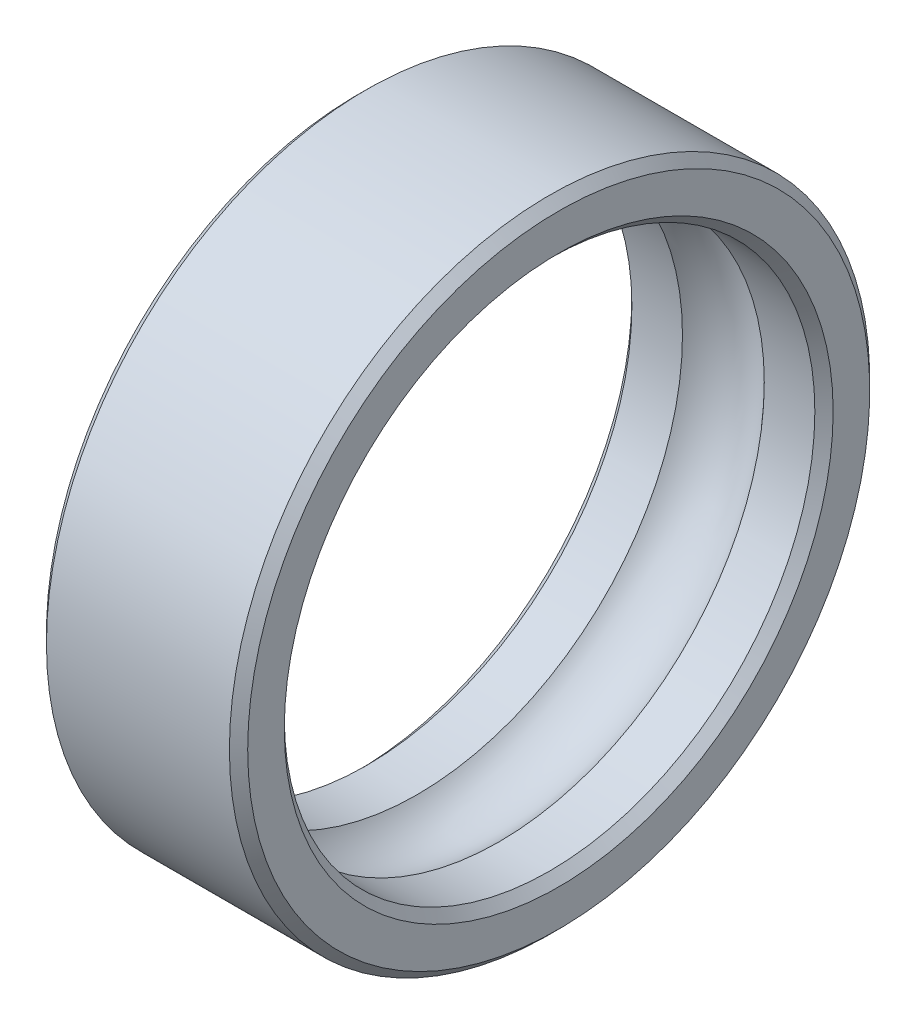
ISO-10303-21;
HEADER;
FILE_DESCRIPTION(('STEP AP214'),'2;1');
FILE_NAME('part.step','',(''),(''),'','','');
FILE_SCHEMA(('AUTOMOTIVE_DESIGN { 1 0 10303 214 1 1 1 1 }'));
ENDSEC;
DATA;
#1=APPLICATION_CONTEXT('core data for automotive mechanical design processes');
#2=APPLICATION_PROTOCOL_DEFINITION('international standard','automotive_design',2000,#1);
#3=PRODUCT_CONTEXT('',#1,'mechanical');
#4=PRODUCT('Part','Part','',(#3));
#5=PRODUCT_RELATED_PRODUCT_CATEGORY('part','',(#4));
#6=PRODUCT_DEFINITION_FORMATION('','',#4);
#7=PRODUCT_DEFINITION_CONTEXT('part definition',#1,'design');
#8=PRODUCT_DEFINITION('design','',#6,#7);
#9=PRODUCT_DEFINITION_SHAPE('','',#8);
#10=(LENGTH_UNIT() NAMED_UNIT(*) SI_UNIT(.MILLI.,.METRE.));
#11=(NAMED_UNIT(*) PLANE_ANGLE_UNIT() SI_UNIT($,.RADIAN.));
#12=(NAMED_UNIT(*) SI_UNIT($,.STERADIAN.) SOLID_ANGLE_UNIT());
#13=UNCERTAINTY_MEASURE_WITH_UNIT(LENGTH_MEASURE(1.E-05),#10,'distance_accuracy_value','');
#14=(GEOMETRIC_REPRESENTATION_CONTEXT(3) GLOBAL_UNCERTAINTY_ASSIGNED_CONTEXT((#13)) GLOBAL_UNIT_ASSIGNED_CONTEXT((#10,
#11,#12)) REPRESENTATION_CONTEXT('',''));
#15=CARTESIAN_POINT('',(0.,0.,0.));
#16=DIRECTION('',(0.,0.,1.));
#17=DIRECTION('',(1.,0.,0.));
#18=AXIS2_PLACEMENT_3D('',#15,#16,#17);
#19=CARTESIAN_POINT('',(-5.5,14.5,0.));
#20=DIRECTION('',(1.,0.,0.));
#21=DIRECTION('',(0.,0.,-1.));
#22=AXIS2_PLACEMENT_3D('',#19,#20,#21);
#23=PLANE('',#22);
#24=CARTESIAN_POINT('',(-5.5,0.,0.));
#25=DIRECTION('',(1.,0.,0.));
#26=DIRECTION('',(0.,0.,-1.));
#27=AXIS2_PLACEMENT_3D('',#24,#25,#26);
#28=CIRCLE('',#27,15.);
#29=CARTESIAN_POINT('',(-5.5,0.,-15.));
#30=VERTEX_POINT('',#29);
#31=EDGE_CURVE('E10',#30,#30,#28,.T.);
#32=ORIENTED_EDGE('',*,*,#31,.T.);
#33=EDGE_LOOP('',(#32));
#34=FACE_BOUND('',#33,.T.);
#35=CARTESIAN_POINT('',(-5.5,0.,0.));
#36=DIRECTION('',(1.,0.,0.));
#37=DIRECTION('',(0.,0.,-1.));
#38=AXIS2_PLACEMENT_3D('',#35,#36,#37);
#39=CIRCLE('',#38,17.);
#40=CARTESIAN_POINT('',(-5.5,0.,-17.));
#41=VERTEX_POINT('',#40);
#42=EDGE_CURVE('E50',#41,#41,#39,.F.);
#43=ORIENTED_EDGE('',*,*,#42,.T.);
#44=EDGE_LOOP('',(#43));
#45=FACE_BOUND('',#44,.T.);
#46=ADVANCED_FACE('F30',(#34,#45),#23,.F.);
#47=CARTESIAN_POINT('',(-7.5,0.,0.));
#48=DIRECTION('',(-1.,0.,0.));
#49=DIRECTION('',(0.,0.,1.));
#50=AXIS2_PLACEMENT_3D('',#47,#48,#49);
#51=CYLINDRICAL_SURFACE('',#50,17.5);
#52=CARTESIAN_POINT('',(5.,0.,0.));
#53=DIRECTION('',(-1.,0.,0.));
#54=DIRECTION('',(0.,0.,1.));
#55=AXIS2_PLACEMENT_3D('',#52,#53,#54);
#56=CIRCLE('',#55,17.5);
#57=CARTESIAN_POINT('',(5.,0.,17.5));
#58=VERTEX_POINT('',#57);
#59=EDGE_CURVE('E56',#58,#58,#56,.T.);
#60=ORIENTED_EDGE('',*,*,#59,.T.);
#61=EDGE_LOOP('',(#60));
#62=FACE_BOUND('',#61,.T.);
#63=CARTESIAN_POINT('',(-5.,0.,0.));
#64=DIRECTION('',(1.,0.,0.));
#65=DIRECTION('',(0.,0.,-1.));
#66=AXIS2_PLACEMENT_3D('',#63,#64,#65);
#67=CIRCLE('',#66,17.5);
#68=CARTESIAN_POINT('',(-5.,0.,-17.5));
#69=VERTEX_POINT('',#68);
#70=EDGE_CURVE('E59',#69,#69,#67,.T.);
#71=ORIENTED_EDGE('',*,*,#70,.T.);
#72=EDGE_LOOP('',(#71));
#73=FACE_BOUND('',#72,.T.);
#74=ADVANCED_FACE('F86',(#62,#73),#51,.T.);
#75=CARTESIAN_POINT('',(5.5,14.5,0.));
#76=DIRECTION('',(-1.,0.,0.));
#77=DIRECTION('',(0.,0.,1.));
#78=AXIS2_PLACEMENT_3D('',#75,#76,#77);
#79=PLANE('',#78);
#80=CARTESIAN_POINT('',(5.5,0.,0.));
#81=DIRECTION('',(-1.,0.,0.));
#82=DIRECTION('',(0.,0.,1.));
#83=AXIS2_PLACEMENT_3D('',#80,#81,#82);
#84=CIRCLE('',#83,15.);
#85=CARTESIAN_POINT('',(5.5,0.,15.));
#86=VERTEX_POINT('',#85);
#87=EDGE_CURVE('E45',#86,#86,#84,.T.);
#88=ORIENTED_EDGE('',*,*,#87,.T.);
#89=EDGE_LOOP('',(#88));
#90=FACE_BOUND('',#89,.T.);
#91=CARTESIAN_POINT('',(5.5,0.,0.));
#92=DIRECTION('',(-1.,0.,0.));
#93=DIRECTION('',(0.,0.,1.));
#94=AXIS2_PLACEMENT_3D('',#91,#92,#93);
#95=CIRCLE('',#94,17.);
#96=CARTESIAN_POINT('',(5.5,0.,17.));
#97=VERTEX_POINT('',#96);
#98=EDGE_CURVE('E53',#97,#97,#95,.F.);
#99=ORIENTED_EDGE('',*,*,#98,.T.);
#100=EDGE_LOOP('',(#99));
#101=FACE_BOUND('',#100,.T.);
#102=ADVANCED_FACE('F91',(#90,#101),#79,.F.);
#103=CARTESIAN_POINT('',(-7.5,0.,0.));
#104=DIRECTION('',(-1.,0.,0.));
#105=DIRECTION('',(0.,0.,1.));
#106=AXIS2_PLACEMENT_3D('',#103,#104,#105);
#107=CYLINDRICAL_SURFACE('',#106,14.5);
#108=CARTESIAN_POINT('',(5.,0.,0.));
#109=DIRECTION('',(-1.,0.,0.));
#110=DIRECTION('',(0.,0.,1.));
#111=AXIS2_PLACEMENT_3D('',#108,#109,#110);
#112=CIRCLE('',#111,14.5);
#113=CARTESIAN_POINT('',(5.,0.,14.5));
#114=VERTEX_POINT('',#113);
#115=EDGE_CURVE('E41',#114,#114,#112,.F.);
#116=ORIENTED_EDGE('',*,*,#115,.T.);
#117=EDGE_LOOP('',(#116));
#118=FACE_BOUND('',#117,.T.);
#119=CARTESIAN_POINT('',(2.23606797749979,0.,0.));
#120=DIRECTION('',(-1.,0.,0.));
#121=DIRECTION('',(0.,0.,1.));
#122=AXIS2_PLACEMENT_3D('',#119,#120,#121);
#123=CIRCLE('',#122,14.5);
#124=CARTESIAN_POINT('',(2.23606797749979,0.,14.5));
#125=VERTEX_POINT('',#124);
#126=EDGE_CURVE('E62',#125,#125,#123,.T.);
#127=ORIENTED_EDGE('',*,*,#126,.T.);
#128=EDGE_LOOP('',(#127));
#129=FACE_BOUND('',#128,.T.);
#130=ADVANCED_FACE('F82',(#118,#129),#107,.F.);
#131=CARTESIAN_POINT('',(0.,0.,0.));
#132=DIRECTION('',(-1.,0.,0.));
#133=DIRECTION('',(0.,0.,1.));
#134=AXIS2_PLACEMENT_3D('',#131,#132,#133);
#135=TOROIDAL_SURFACE('',#134,12.5,3.);
#136=ORIENTED_EDGE('',*,*,#126,.F.);
#137=EDGE_LOOP('',(#136));
#138=FACE_BOUND('',#137,.T.);
#139=CARTESIAN_POINT('',(-2.23606797749979,0.,0.));
#140=DIRECTION('',(-1.,0.,0.));
#141=DIRECTION('',(0.,0.,1.));
#142=AXIS2_PLACEMENT_3D('',#139,#140,#141);
#143=CIRCLE('',#142,14.5);
#144=CARTESIAN_POINT('',(-2.23606797749979,0.,14.5));
#145=VERTEX_POINT('',#144);
#146=EDGE_CURVE('E65',#145,#145,#143,.T.);
#147=ORIENTED_EDGE('',*,*,#146,.T.);
#148=EDGE_LOOP('',(#147));
#149=FACE_BOUND('',#148,.T.);
#150=ADVANCED_FACE('F69',(#138,#149),#135,.F.);
#151=CARTESIAN_POINT('',(-7.5,0.,0.));
#152=DIRECTION('',(-1.,0.,0.));
#153=DIRECTION('',(0.,0.,1.));
#154=AXIS2_PLACEMENT_3D('',#151,#152,#153);
#155=CYLINDRICAL_SURFACE('',#154,14.5);
#156=CARTESIAN_POINT('',(-4.99999999999999,0.,0.));
#157=DIRECTION('',(1.,0.,0.));
#158=DIRECTION('',(0.,0.,-1.));
#159=AXIS2_PLACEMENT_3D('',#156,#157,#158);
#160=CIRCLE('',#159,14.5);
#161=CARTESIAN_POINT('',(-4.99999999999999,0.,-14.5));
#162=VERTEX_POINT('',#161);
#163=EDGE_CURVE('E37',#162,#162,#160,.F.);
#164=ORIENTED_EDGE('',*,*,#163,.T.);
#165=EDGE_LOOP('',(#164));
#166=FACE_BOUND('',#165,.T.);
#167=ORIENTED_EDGE('',*,*,#146,.F.);
#168=EDGE_LOOP('',(#167));
#169=FACE_BOUND('',#168,.T.);
#170=ADVANCED_FACE('F71',(#166,#169),#155,.F.);
#171=CARTESIAN_POINT('',(5.,0.,0.));
#172=DIRECTION('',(-1.,0.,0.));
#173=DIRECTION('',(0.,0.,1.));
#174=AXIS2_PLACEMENT_3D('',#171,#172,#173);
#175=CONICAL_SURFACE('',#174,17.5,0.785398163397448);
#176=ORIENTED_EDGE('',*,*,#98,.F.);
#177=EDGE_LOOP('',(#176));
#178=FACE_BOUND('',#177,.T.);
#179=ORIENTED_EDGE('',*,*,#59,.F.);
#180=EDGE_LOOP('',(#179));
#181=FACE_BOUND('',#180,.T.);
#182=ADVANCED_FACE('F73',(#178,#181),#175,.T.);
#183=CARTESIAN_POINT('',(-5.5,0.,0.));
#184=DIRECTION('',(1.,0.,0.));
#185=DIRECTION('',(0.,0.,-1.));
#186=AXIS2_PLACEMENT_3D('',#183,#184,#185);
#187=CONICAL_SURFACE('',#186,17.,0.785398163397448);
#188=ORIENTED_EDGE('',*,*,#70,.F.);
#189=EDGE_LOOP('',(#188));
#190=FACE_BOUND('',#189,.T.);
#191=ORIENTED_EDGE('',*,*,#42,.F.);
#192=EDGE_LOOP('',(#191));
#193=FACE_BOUND('',#192,.T.);
#194=ADVANCED_FACE('F79',(#190,#193),#187,.T.);
#195=CARTESIAN_POINT('',(5.5,0.,0.));
#196=DIRECTION('',(1.,0.,0.));
#197=DIRECTION('',(0.,0.,-1.));
#198=AXIS2_PLACEMENT_3D('',#195,#196,#197);
#199=CONICAL_SURFACE('',#198,15.,0.78539816339745);
#200=ORIENTED_EDGE('',*,*,#115,.F.);
#201=EDGE_LOOP('',(#200));
#202=FACE_BOUND('',#201,.T.);
#203=ORIENTED_EDGE('',*,*,#87,.F.);
#204=EDGE_LOOP('',(#203));
#205=FACE_BOUND('',#204,.T.);
#206=ADVANCED_FACE('F98',(#202,#205),#199,.F.);
#207=CARTESIAN_POINT('',(-4.99999999999999,0.,0.));
#208=DIRECTION('',(-1.,0.,0.));
#209=DIRECTION('',(0.,0.,1.));
#210=AXIS2_PLACEMENT_3D('',#207,#208,#209);
#211=CONICAL_SURFACE('',#210,14.5,0.785398163397447);
#212=ORIENTED_EDGE('',*,*,#31,.F.);
#213=EDGE_LOOP('',(#212));
#214=FACE_BOUND('',#213,.T.);
#215=ORIENTED_EDGE('',*,*,#163,.F.);
#216=EDGE_LOOP('',(#215));
#217=FACE_BOUND('',#216,.T.);
#218=ADVANCED_FACE('F32',(#214,#217),#211,.F.);
#219=CLOSED_SHELL('',(#46,#74,#102,#130,#150,#170,#182,#194,#206,#218));
#220=MANIFOLD_SOLID_BREP('B2',#219);
#221=ADVANCED_BREP_SHAPE_REPRESENTATION('',(#18,#220),#14);
#222=SHAPE_DEFINITION_REPRESENTATION(#9,#221);
ENDSEC;
END-ISO-10303-21;
